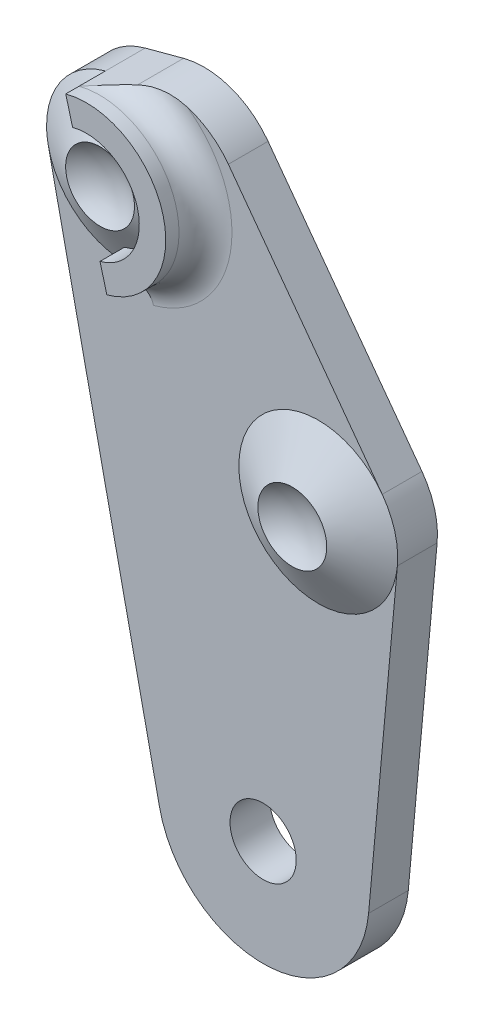
ISO-10303-21;
HEADER;
FILE_DESCRIPTION(('STEP AP214'),'2;1');
FILE_NAME('part.step','',(''),(''),'','','');
FILE_SCHEMA(('AUTOMOTIVE_DESIGN { 1 0 10303 214 1 1 1 1 }'));
ENDSEC;
DATA;
#1=APPLICATION_CONTEXT('core data for automotive mechanical design processes');
#2=APPLICATION_PROTOCOL_DEFINITION('international standard','automotive_design',2000,#1);
#3=PRODUCT_CONTEXT('',#1,'mechanical');
#4=PRODUCT('Part','Part','',(#3));
#5=PRODUCT_RELATED_PRODUCT_CATEGORY('part','',(#4));
#6=PRODUCT_DEFINITION_FORMATION('','',#4);
#7=PRODUCT_DEFINITION_CONTEXT('part definition',#1,'design');
#8=PRODUCT_DEFINITION('design','',#6,#7);
#9=PRODUCT_DEFINITION_SHAPE('','',#8);
#10=(LENGTH_UNIT() NAMED_UNIT(*) SI_UNIT(.MILLI.,.METRE.));
#11=(NAMED_UNIT(*) PLANE_ANGLE_UNIT() SI_UNIT($,.RADIAN.));
#12=(NAMED_UNIT(*) SI_UNIT($,.STERADIAN.) SOLID_ANGLE_UNIT());
#13=UNCERTAINTY_MEASURE_WITH_UNIT(LENGTH_MEASURE(1.E-05),#10,'distance_accuracy_value','');
#14=(GEOMETRIC_REPRESENTATION_CONTEXT(3) GLOBAL_UNCERTAINTY_ASSIGNED_CONTEXT((#13)) GLOBAL_UNIT_ASSIGNED_CONTEXT((#10,
#11,#12)) REPRESENTATION_CONTEXT('',''));
#15=CARTESIAN_POINT('',(0.,0.,0.));
#16=DIRECTION('',(0.,0.,1.));
#17=DIRECTION('',(1.,0.,0.));
#18=AXIS2_PLACEMENT_3D('',#15,#16,#17);
#19=CARTESIAN_POINT('',(-10.352761804101,38.6370330515627,5.));
#20=DIRECTION('',(0.,0.,-1.));
#21=DIRECTION('',(-1.,0.,0.));
#22=AXIS2_PLACEMENT_3D('',#19,#20,#21);
#23=CONICAL_SURFACE('',#22,2.53589838486217,1.0471975511966);
#24=CARTESIAN_POINT('',(-10.352761804101,38.6370330515627,4.96189209298539));
#25=DIRECTION('',(0.,0.,-1.));
#26=DIRECTION('',(-1.,0.,0.));
#27=AXIS2_PLACEMENT_3D('',#24,#25,#26);
#28=CIRCLE('',#27,2.60190321598159);
#29=CARTESIAN_POINT('',(-12.9546650200826,38.6370330515627,4.96189209298539));
#30=VERTEX_POINT('',#29);
#31=EDGE_CURVE('E402',#30,#30,#28,.F.);
#32=ORIENTED_EDGE('',*,*,#31,.F.);
#33=EDGE_LOOP('',(#32));
#34=FACE_BOUND('',#33,.T.);
#35=CARTESIAN_POINT('',(-10.352761804101,38.6370330515627,3.));
#36=DIRECTION('',(0.,0.,1.));
#37=DIRECTION('',(1.,0.,0.));
#38=AXIS2_PLACEMENT_3D('',#35,#36,#37);
#39=CIRCLE('',#38,6.);
#40=CARTESIAN_POINT('',(-8.79984753348584,32.8414780938283,3.));
#41=VERTEX_POINT('',#40);
#42=CARTESIAN_POINT('',(-16.2187134982231,37.3758388864057,3.));
#43=VERTEX_POINT('',#42);
#44=EDGE_CURVE('E377',#41,#43,#39,.F.);
#45=ORIENTED_EDGE('',*,*,#44,.F.);
#46=DIRECTION('',(0.224143868042018,-0.836516303737809,-0.499999999999997));
#47=VECTOR('',#46,1.);
#48=CARTESIAN_POINT('',(-10.352761804101,38.6370330515627,6.4641016151377));
#49=LINE('',#48,#47);
#50=CARTESIAN_POINT('',(-9.3174856236909,34.7733297464064,4.15470053837922));
#51=VERTEX_POINT('',#50);
#52=EDGE_CURVE('E414',#41,#51,#49,.F.);
#53=ORIENTED_EDGE('',*,*,#52,.T.);
#54=CARTESIAN_POINT('',(-10.352761804101,38.6370330515627,4.15470053837922));
#55=DIRECTION('',(0.,0.,-1.));
#56=DIRECTION('',(-1.,0.,0.));
#57=AXIS2_PLACEMENT_3D('',#54,#55,#56);
#58=CIRCLE('',#57,4.);
#59=CARTESIAN_POINT('',(-11.3880379845111,42.500736356719,4.15470053837922));
#60=VERTEX_POINT('',#59);
#61=EDGE_CURVE('E192',#60,#51,#58,.T.);
#62=ORIENTED_EDGE('',*,*,#61,.F.);
#63=DIRECTION('',(-0.224143868042018,0.836516303737809,-0.499999999999997));
#64=VECTOR('',#63,1.);
#65=CARTESIAN_POINT('',(-10.352761804101,38.6370330515627,6.4641016151377));
#66=LINE('',#65,#64);
#67=CARTESIAN_POINT('',(-11.9056760747161,44.4325880092971,3.));
#68=VERTEX_POINT('',#67);
#69=EDGE_CURVE('E409',#68,#60,#66,.F.);
#70=ORIENTED_EDGE('',*,*,#69,.F.);
#71=CARTESIAN_POINT('',(-10.352761804101,38.6370330515627,2.99999999999998));
#72=DIRECTION('',(0.,0.,1.));
#73=DIRECTION('',(1.,0.,0.));
#74=AXIS2_PLACEMENT_3D('',#71,#72,#73);
#75=CIRCLE('',#74,6.);
#76=EDGE_CURVE('E406',#43,#68,#75,.F.);
#77=ORIENTED_EDGE('',*,*,#76,.F.);
#78=EDGE_LOOP('',(#45,#53,#62,#70,#77));
#79=FACE_BOUND('',#78,.T.);
#80=ADVANCED_FACE('F75',(#34,#79),#23,.T.);
#81=CARTESIAN_POINT('',(-11.905676074716,44.4325880092971,3.));
#82=DIRECTION('',(-0.258819045102522,0.965925826289068,0.));
#83=DIRECTION('',(-0.965925826289068,-0.258819045102522,0.));
#84=AXIS2_PLACEMENT_3D('',#81,#82,#83);
#85=PLANE('',#84);
#86=DIRECTION('',(0.965925826289068,0.258819045102522,0.));
#87=VECTOR('',#86,1.);
#88=CARTESIAN_POINT('',(-11.905676074716,44.4325880092971,0.));
#89=LINE('',#88,#87);
#90=CARTESIAN_POINT('',(-11.9056760747161,44.4325880092971,0.));
#91=VERTEX_POINT('',#90);
#92=CARTESIAN_POINT('',(-9.00789859584892,45.2090451446047,0.));
#93=VERTEX_POINT('',#92);
#94=EDGE_CURVE('E449',#91,#93,#89,.T.);
#95=ORIENTED_EDGE('',*,*,#94,.F.);
#96=DIRECTION('',(0.,0.,-1.));
#97=VECTOR('',#96,1.);
#98=CARTESIAN_POINT('',(-11.9056760747161,44.4325880092971,3.));
#99=LINE('',#98,#97);
#100=EDGE_CURVE('E378',#68,#91,#99,.T.);
#101=ORIENTED_EDGE('',*,*,#100,.F.);
#102=DIRECTION('',(0.,0.,1.));
#103=VECTOR('',#102,1.);
#104=CARTESIAN_POINT('',(-11.9056760747161,44.4325880092971,3.));
#105=LINE('',#104,#103);
#106=CARTESIAN_POINT('',(-11.9056760747161,44.4325880092971,4.95765130950164));
#107=VERTEX_POINT('',#106);
#108=EDGE_CURVE('E12',#68,#107,#105,.T.);
#109=ORIENTED_EDGE('',*,*,#108,.T.);
#110=CARTESIAN_POINT('',(-9.00789859584756,45.209045144605,3.47265604705682));
#111=CARTESIAN_POINT('',(-9.04167602131454,45.1999963236107,3.48588271866781));
#112=CARTESIAN_POINT('',(-9.07539019870311,45.1909840043056,3.49929570066469));
#113=CARTESIAN_POINT('',(-9.14426785292339,45.172593222539,3.5271272091169));
#114=CARTESIAN_POINT('',(-9.1794249329425,45.1632174705452,3.54156336105153));
#115=CARTESIAN_POINT('',(-9.25113729258122,45.1440948968317,3.57147686776905));
#116=CARTESIAN_POINT('',(-9.28768565382772,45.134349999916,3.58697203592648));
#117=CARTESIAN_POINT('',(-9.36213166456127,45.1144905466228,3.61903400530673));
#118=CARTESIAN_POINT('',(-9.40002207359846,45.1043775082806,3.63561855543702));
#119=CARTESIAN_POINT('',(-9.47710507009265,45.0837863746335,3.66988454608979));
#120=CARTESIAN_POINT('',(-9.51629022913966,45.0733095732774,3.68758346951129));
#121=CARTESIAN_POINT('',(-9.59591876767549,45.0519992802468,3.72409700991216));
#122=CARTESIAN_POINT('',(-9.63635467851947,45.0411670302717,3.74292863232235));
#123=CARTESIAN_POINT('',(-9.7184448059844,45.0191571338207,3.7817190476073));
#124=CARTESIAN_POINT('',(-9.76009165385731,45.0079807897721,3.80169416516658));
#125=CARTESIAN_POINT('',(-9.84456890442968,44.985296210418,3.84277466150193));
#126=CARTESIAN_POINT('',(-9.88739217866162,44.9737894096257,3.86389548184489));
#127=CARTESIAN_POINT('',(-9.97419342460878,44.9504582124338,3.90726156361966));
#128=CARTESIAN_POINT('',(-10.0181646349715,44.9386353991369,3.9295211993021));
#129=CARTESIAN_POINT('',(-10.1072407286592,44.9146867939,3.97514801279929));
#130=CARTESIAN_POINT('',(-10.1523393698729,44.9025627363057,3.99852827732888));
#131=CARTESIAN_POINT('',(-10.2436534094104,44.8780211303456,4.04637280331815));
#132=CARTESIAN_POINT('',(-10.2898631111719,44.8656053093231,4.0708488096733));
#133=CARTESIAN_POINT('',(-10.3833979302187,44.8404987942321,4.12083298856933));
#134=CARTESIAN_POINT('',(-10.4307183430287,44.8278100542277,4.1463509392209));
#135=CARTESIAN_POINT('',(-10.5181082230742,44.8043786270815,4.19389590274084));
#136=CARTESIAN_POINT('',(-10.5582026490752,44.7936289858507,4.21587361758575));
#137=CARTESIAN_POINT('',(-10.6380743608064,44.7722031401885,4.25998929462108));
#138=CARTESIAN_POINT('',(-10.6778522615783,44.7615268230661,4.28212608920199));
#139=CARTESIAN_POINT('',(-10.7571369895071,44.7402578529714,4.32649580707994));
#140=CARTESIAN_POINT('',(-10.7966442428341,44.7296650381198,4.34872789217054));
#141=CARTESIAN_POINT('',(-10.8754137550958,44.7085581113514,4.39325550051093));
#142=CARTESIAN_POINT('',(-10.9146763469077,44.6980438556443,4.41555036748384));
#143=CARTESIAN_POINT('',(-10.9852091855151,44.6791824319643,4.45567795908585));
#144=CARTESIAN_POINT('',(-11.0164847006962,44.6708284170642,4.47349820820621));
#145=CARTESIAN_POINT('',(-11.085668188211,44.6523299598277,4.5130928424685));
#146=CARTESIAN_POINT('',(-11.123560026977,44.6421857886112,4.53489558372811));
#147=CARTESIAN_POINT('',(-11.2000819352414,44.6216807965588,4.57914604331005));
#148=CARTESIAN_POINT('',(-11.2387099304274,44.6113201132121,4.601597406804));
#149=CARTESIAN_POINT('',(-11.3223349427543,44.5888984016681,4.65027746334244));
#150=CARTESIAN_POINT('',(-11.3673270336477,44.5768400091873,4.67651580419771));
#151=CARTESIAN_POINT('',(-11.432086021426,44.5594857868869,4.71428689159529));
#152=CARTESIAN_POINT('',(-11.4518538815426,44.5541886205339,4.7258173115153));
#153=CARTESIAN_POINT('',(-11.5046538235443,44.5400427314638,4.75656853217785));
#154=CARTESIAN_POINT('',(-11.5376990857459,44.5311923789401,4.77576584978908));
#155=CARTESIAN_POINT('',(-11.6083552324944,44.5122602576858,4.8167415133963));
#156=CARTESIAN_POINT('',(-11.6459699852869,44.5021762682724,4.83851231300789));
#157=CARTESIAN_POINT('',(-11.7042623084172,44.4865565450032,4.8715312927657));
#158=CARTESIAN_POINT('',(-11.7248045781052,44.4810535861182,4.88303086092318));
#159=CARTESIAN_POINT('',(-11.7537366221794,44.4733014204199,4.89879506441286));
#160=CARTESIAN_POINT('',(-11.7620238279567,44.4710807189892,4.90326141960327));
#161=CARTESIAN_POINT('',(-11.7772764585073,44.4669928898353,4.91134848530935));
#162=CARTESIAN_POINT('',(-11.784233224436,44.4651281852922,4.91498662618188));
#163=CARTESIAN_POINT('',(-11.7973056675326,44.4616260654568,4.92162107273644));
#164=CARTESIAN_POINT('',(-11.8034110920751,44.4599911550067,4.92463868995831));
#165=CARTESIAN_POINT('',(-11.8152475983522,44.4568229224278,4.93025942187981));
#166=CARTESIAN_POINT('',(-11.820972366615,44.4552911897947,4.93287664690089));
#167=CARTESIAN_POINT('',(-11.8320445853177,44.4523283924517,4.93770341316084));
#168=CARTESIAN_POINT('',(-11.8373855439114,44.4508990877868,4.9399288180526));
#169=CARTESIAN_POINT('',(-11.8476913048996,44.448140102198,4.94396895313205));
#170=CARTESIAN_POINT('',(-11.8526491816093,44.4468123636893,4.94580253015313));
#171=CARTESIAN_POINT('',(-11.8621896871411,44.4442559477416,4.94905799975259));
#172=CARTESIAN_POINT('',(-11.8667650961756,44.4430293349206,4.95050221691119));
#173=CARTESIAN_POINT('',(-11.8735147092843,44.4412188650989,4.95240359716884));
#174=CARTESIAN_POINT('',(-11.8756592203849,44.4406434938958,4.95297440056373));
#175=CARTESIAN_POINT('',(-11.8798534924646,44.4395179377958,4.95401472601373));
#176=CARTESIAN_POINT('',(-11.8819023881481,44.4389679972706,4.95448796913324));
#177=CARTESIAN_POINT('',(-11.8859053807458,44.4378934250594,4.95533302862299));
#178=CARTESIAN_POINT('',(-11.8878586688654,44.4373690177506,4.9557089233246));
#179=CARTESIAN_POINT('',(-11.8916704135926,44.4363456673164,4.95635886181297));
#180=CARTESIAN_POINT('',(-11.8935281507023,44.4358469171159,4.9566373836276));
#181=CARTESIAN_POINT('',(-11.8971488773029,44.43487502671,4.95709246748238));
#182=CARTESIAN_POINT('',(-11.898911273816,44.4344020359085,4.95727391081613));
#183=CARTESIAN_POINT('',(-11.9023407966894,44.4334820395714,4.9575335492382));
#184=CARTESIAN_POINT('',(-11.904007546426,44.4330351110449,4.95761710237473));
#185=CARTESIAN_POINT('',(-11.9056760747162,44.4325880092971,4.95765130950164));
#186=B_SPLINE_CURVE_WITH_KNOTS('',3,(#110,#111,#112,#113,#114,#115,#116,#117,#118,#119,#120,
#121,#122,#123,#124,#125,#126,#127,#128,#129,#130,#131,#132,#133,#134,#135,#136,#137,#138,#139,
#140,#141,#142,#143,#144,#145,#146,#147,#148,#149,#150,#151,#152,#153,#154,#155,#156,#157,#158,
#159,#160,#161,#162,#163,#164,#165,#166,#167,#168,#169,#170,#171,#172,#173,#174,#175,#176,#177,
#178,#179,#180,#181,#182,#183,#184,#185),.UNSPECIFIED.,.F.,.F.,(4,2,2,2,2,2,2,2,2,2,2,2,2,2,2,2,
2,2,2,2,2,2,2,2,2,2,2,2,2,2,2,2,2,2,2,2,2,4),(0.,0.11215848790164,0.229590984478318,
0.352216367318028,0.479951775498032,0.612713478374603,0.750417795832572,0.892982079031889,
1.04032575747692,1.19237145570279,1.34904618093977,1.51028057844895,1.67599732779022,
1.81690500816826,1.95717803438317,2.09684030805282,2.23591730604148,2.34677558217332,
2.4814097123581,2.61900227365014,2.77938716130006,2.84985703809425,2.96754203000781,
3.10138636883245,3.17391236213883,3.20292944134138,3.22713553293138,3.24814492197249,
3.26757681716014,3.28545276369552,3.30179887705272,3.31664789706194,3.32352456606239,
3.3300439946601,3.33621379328448,3.34204289392527,3.34754184962866,3.35272320142118),.UNSPECIFIED.);
#187=CARTESIAN_POINT('',(-9.00789859584892,45.2090451446047,3.47265604705558));
#188=VERTEX_POINT('',#187);
#189=EDGE_CURVE('E282',#107,#188,#186,.F.);
#190=ORIENTED_EDGE('',*,*,#189,.T.);
#191=DIRECTION('',(0.,0.,-1.));
#192=VECTOR('',#191,1.);
#193=CARTESIAN_POINT('',(-9.00789859584892,45.2090451446047,3.));
#194=LINE('',#193,#192);
#195=EDGE_CURVE('E105',#188,#93,#194,.T.);
#196=ORIENTED_EDGE('',*,*,#195,.T.);
#197=EDGE_LOOP('',(#95,#101,#109,#190,#196));
#198=FACE_BOUND('',#197,.T.);
#199=ADVANCED_FACE('F289',(#198),#85,.T.);
#200=CARTESIAN_POINT('',(-10.352761804101,38.6370330515627,3.));
#201=DIRECTION('',(0.,0.,-1.));
#202=DIRECTION('',(-1.,0.,0.));
#203=AXIS2_PLACEMENT_3D('',#200,#201,#202);
#204=CYLINDRICAL_SURFACE('',#203,6.);
#205=DIRECTION('',(0.,0.,-1.));
#206=VECTOR('',#205,1.);
#207=CARTESIAN_POINT('',(-16.2187134982231,37.3758388864057,3.));
#208=LINE('',#207,#206);
#209=CARTESIAN_POINT('',(-16.2187134982231,37.3758388864057,0.));
#210=VERTEX_POINT('',#209);
#211=EDGE_CURVE('E384',#43,#210,#208,.T.);
#212=ORIENTED_EDGE('',*,*,#211,.F.);
#213=ORIENTED_EDGE('',*,*,#76,.T.);
#214=ORIENTED_EDGE('',*,*,#100,.T.);
#215=CARTESIAN_POINT('',(-10.352761804101,38.6370330515627,0.));
#216=DIRECTION('',(0.,0.,1.));
#217=DIRECTION('',(1.,0.,0.));
#218=AXIS2_PLACEMENT_3D('',#215,#216,#217);
#219=CIRCLE('',#218,6.);
#220=EDGE_CURVE('E453',#91,#210,#219,.T.);
#221=ORIENTED_EDGE('',*,*,#220,.T.);
#222=EDGE_LOOP('',(#212,#213,#214,#221));
#223=FACE_BOUND('',#222,.T.);
#224=ADVANCED_FACE('F299',(#223),#204,.T.);
#225=CARTESIAN_POINT('',(-7.82126892549614,-1.68159222020933,3.));
#226=DIRECTION('',(-0.977658615687017,-0.210199027526166,0.));
#227=DIRECTION('',(0.210199027526166,-0.977658615687017,0.));
#228=AXIS2_PLACEMENT_3D('',#225,#226,#227);
#229=PLANE('',#228);
#230=DIRECTION('',(-0.210199027526166,0.977658615687017,0.));
#231=VECTOR('',#230,1.);
#232=CARTESIAN_POINT('',(-7.82126892549614,-1.68159222020933,0.));
#233=LINE('',#232,#231);
#234=CARTESIAN_POINT('',(-7.82126892549614,-1.68159222020933,0.));
#235=VERTEX_POINT('',#234);
#236=EDGE_CURVE('E456',#235,#210,#233,.T.);
#237=ORIENTED_EDGE('',*,*,#236,.F.);
#238=DIRECTION('',(0.,0.,-1.));
#239=VECTOR('',#238,1.);
#240=CARTESIAN_POINT('',(-7.82126892549614,-1.68159222020933,3.));
#241=LINE('',#240,#239);
#242=CARTESIAN_POINT('',(-7.82126892549614,-1.68159222020933,3.));
#243=VERTEX_POINT('',#242);
#244=EDGE_CURVE('E392',#243,#235,#241,.T.);
#245=ORIENTED_EDGE('',*,*,#244,.F.);
#246=DIRECTION('',(-0.210199027526166,0.977658615687017,0.));
#247=VECTOR('',#246,1.);
#248=CARTESIAN_POINT('',(-7.82126892549614,-1.68159222020933,3.));
#249=LINE('',#248,#247);
#250=EDGE_CURVE('E423',#243,#43,#249,.T.);
#251=ORIENTED_EDGE('',*,*,#250,.T.);
#252=ORIENTED_EDGE('',*,*,#211,.T.);
#253=EDGE_LOOP('',(#237,#245,#251,#252));
#254=FACE_BOUND('',#253,.T.);
#255=ADVANCED_FACE('F498',(#254),#229,.T.);
#256=CARTESIAN_POINT('',(0.,0.,3.));
#257=DIRECTION('',(0.,0.,-1.));
#258=DIRECTION('',(-1.,0.,0.));
#259=AXIS2_PLACEMENT_3D('',#256,#257,#258);
#260=CYLINDRICAL_SURFACE('',#259,8.);
#261=CARTESIAN_POINT('',(0.,0.,0.));
#262=DIRECTION('',(0.,0.,1.));
#263=DIRECTION('',(1.,0.,0.));
#264=AXIS2_PLACEMENT_3D('',#261,#262,#263);
#265=CIRCLE('',#264,8.);
#266=CARTESIAN_POINT('',(7.96682404667648,-0.727814955395537,0.));
#267=VERTEX_POINT('',#266);
#268=EDGE_CURVE('E460',#235,#267,#265,.T.);
#269=ORIENTED_EDGE('',*,*,#268,.T.);
#270=DIRECTION('',(0.,0.,-1.));
#271=VECTOR('',#270,1.);
#272=CARTESIAN_POINT('',(7.96682404667648,-0.727814955395537,3.));
#273=LINE('',#272,#271);
#274=CARTESIAN_POINT('',(7.96682404667648,-0.727814955395537,3.));
#275=VERTEX_POINT('',#274);
#276=EDGE_CURVE('E483',#275,#267,#273,.T.);
#277=ORIENTED_EDGE('',*,*,#276,.F.);
#278=CARTESIAN_POINT('',(0.,0.,3.));
#279=DIRECTION('',(0.,0.,1.));
#280=DIRECTION('',(1.,0.,0.));
#281=AXIS2_PLACEMENT_3D('',#278,#279,#280);
#282=CIRCLE('',#281,8.);
#283=EDGE_CURVE('E434',#243,#275,#282,.T.);
#284=ORIENTED_EDGE('',*,*,#283,.F.);
#285=ORIENTED_EDGE('',*,*,#244,.T.);
#286=EDGE_LOOP('',(#269,#277,#284,#285));
#287=FACE_BOUND('',#286,.T.);
#288=ADVANCED_FACE('F489',(#287),#260,.T.);
#289=CARTESIAN_POINT('',(7.96682404667648,-0.727814955395536,3.));
#290=DIRECTION('',(0.99585300583456,-0.090976869424442,0.));
#291=DIRECTION('',(0.090976869424442,0.99585300583456,0.));
#292=AXIS2_PLACEMENT_3D('',#289,#290,#291);
#293=PLANE('',#292);
#294=DIRECTION('',(-0.090976869424442,-0.99585300583456,0.));
#295=VECTOR('',#294,1.);
#296=CARTESIAN_POINT('',(7.96682404667648,-0.727814955395536,0.));
#297=LINE('',#296,#295);
#298=CARTESIAN_POINT('',(10.1426742990136,23.0895248557464,0.));
#299=VERTEX_POINT('',#298);
#300=EDGE_CURVE('E464',#299,#267,#297,.T.);
#301=ORIENTED_EDGE('',*,*,#300,.F.);
#302=DIRECTION('',(0.,0.,-1.));
#303=VECTOR('',#302,1.);
#304=CARTESIAN_POINT('',(10.1426742990136,23.0895248557464,3.));
#305=LINE('',#304,#303);
#306=CARTESIAN_POINT('',(10.1426742990136,23.0895248557464,3.));
#307=VERTEX_POINT('',#306);
#308=EDGE_CURVE('E480',#307,#299,#305,.T.);
#309=ORIENTED_EDGE('',*,*,#308,.F.);
#310=DIRECTION('',(-0.090976869424442,-0.99585300583456,0.));
#311=VECTOR('',#310,1.);
#312=CARTESIAN_POINT('',(7.96682404667648,-0.727814955395536,3.));
#313=LINE('',#312,#311);
#314=EDGE_CURVE('E437',#307,#275,#313,.T.);
#315=ORIENTED_EDGE('',*,*,#314,.T.);
#316=ORIENTED_EDGE('',*,*,#276,.T.);
#317=EDGE_LOOP('',(#301,#309,#315,#316));
#318=FACE_BOUND('',#317,.T.);
#319=ADVANCED_FACE('F526',(#318),#293,.T.);
#320=CARTESIAN_POINT('',(4.16755626400626,23.635386072293,3.));
#321=DIRECTION('',(0.,0.,-1.));
#322=DIRECTION('',(-1.,0.,0.));
#323=AXIS2_PLACEMENT_3D('',#320,#321,#322);
#324=CYLINDRICAL_SURFACE('',#323,6.);
#325=DIRECTION('',(0.,0.,-1.));
#326=VECTOR('',#325,1.);
#327=CARTESIAN_POINT('',(8.99839288623359,27.1938994598394,3.));
#328=LINE('',#327,#326);
#329=CARTESIAN_POINT('',(8.99839288623359,27.1938994598394,3.));
#330=VERTEX_POINT('',#329);
#331=CARTESIAN_POINT('',(8.99839288623359,27.1938994598394,0.));
#332=VERTEX_POINT('',#331);
#333=EDGE_CURVE('E477',#330,#332,#328,.T.);
#334=ORIENTED_EDGE('',*,*,#333,.F.);
#335=CARTESIAN_POINT('',(4.16755626400626,23.635386072293,2.99999999999998));
#336=DIRECTION('',(0.,0.,1.));
#337=DIRECTION('',(1.,0.,0.));
#338=AXIS2_PLACEMENT_3D('',#335,#336,#337);
#339=CIRCLE('',#338,6.);
#340=EDGE_CURVE('E399',#330,#307,#339,.F.);
#341=ORIENTED_EDGE('',*,*,#340,.T.);
#342=ORIENTED_EDGE('',*,*,#308,.T.);
#343=CARTESIAN_POINT('',(4.16755626400626,23.635386072293,0.));
#344=DIRECTION('',(0.,0.,1.));
#345=DIRECTION('',(1.,0.,0.));
#346=AXIS2_PLACEMENT_3D('',#343,#344,#345);
#347=CIRCLE('',#346,6.);
#348=EDGE_CURVE('E468',#299,#332,#347,.T.);
#349=ORIENTED_EDGE('',*,*,#348,.T.);
#350=EDGE_LOOP('',(#334,#341,#342,#349));
#351=FACE_BOUND('',#350,.T.);
#352=ADVANCED_FACE('F523',(#351),#324,.T.);
#353=CARTESIAN_POINT('',(18.81874160834,13.8623491512695,3.));
#354=DIRECTION('',(0.80513943703789,0.593085564591071,0.));
#355=DIRECTION('',(-0.593085564591071,0.80513943703789,0.));
#356=AXIS2_PLACEMENT_3D('',#353,#354,#355);
#357=PLANE('',#356);
#358=DIRECTION('',(0.593085564591071,-0.80513943703789,0.));
#359=VECTOR('',#358,1.);
#360=CARTESIAN_POINT('',(18.81874160834,13.8623491512695,0.));
#361=LINE('',#360,#359);
#362=CARTESIAN_POINT('',(-2.62414770300645,42.9720035744167,0.));
#363=VERTEX_POINT('',#362);
#364=EDGE_CURVE('E424',#363,#332,#361,.T.);
#365=ORIENTED_EDGE('',*,*,#364,.F.);
#366=DIRECTION('',(0.,0.,-1.));
#367=VECTOR('',#366,1.);
#368=CARTESIAN_POINT('',(-2.62414770300645,42.9720035744167,3.));
#369=LINE('',#368,#367);
#370=CARTESIAN_POINT('',(-2.62414770300645,42.9720035744167,3.));
#371=VERTEX_POINT('',#370);
#372=EDGE_CURVE('E445',#371,#363,#369,.T.);
#373=ORIENTED_EDGE('',*,*,#372,.F.);
#374=DIRECTION('',(0.593085564591071,-0.80513943703789,0.));
#375=VECTOR('',#374,1.);
#376=CARTESIAN_POINT('',(18.81874160834,13.8623491512695,3.));
#377=LINE('',#376,#375);
#378=EDGE_CURVE('E441',#371,#330,#377,.T.);
#379=ORIENTED_EDGE('',*,*,#378,.T.);
#380=ORIENTED_EDGE('',*,*,#333,.T.);
#381=EDGE_LOOP('',(#365,#373,#379,#380));
#382=FACE_BOUND('',#381,.T.);
#383=ADVANCED_FACE('F306',(#382),#357,.T.);
#384=CARTESIAN_POINT('',(-7.45498432523379,39.4134901868702,3.));
#385=DIRECTION('',(0.,0.,-1.));
#386=DIRECTION('',(-1.,0.,0.));
#387=AXIS2_PLACEMENT_3D('',#384,#385,#386);
#388=CYLINDRICAL_SURFACE('',#387,6.);
#389=CARTESIAN_POINT('',(-7.45498432523379,39.4134901868702,0.));
#390=DIRECTION('',(0.,0.,1.));
#391=DIRECTION('',(1.,0.,0.));
#392=AXIS2_PLACEMENT_3D('',#389,#390,#391);
#393=CIRCLE('',#392,6.);
#394=EDGE_CURVE('E446',#363,#93,#393,.T.);
#395=ORIENTED_EDGE('',*,*,#394,.T.);
#396=ORIENTED_EDGE('',*,*,#195,.F.);
#397=CARTESIAN_POINT('',(-5.71724038179496,45.1563332098896,3.));
#398=CARTESIAN_POINT('',(-5.78957647480747,45.1782233401764,3.00000102332012));
#399=CARTESIAN_POINT('',(-5.86232472606309,45.1987570039787,3.00043580808809));
#400=CARTESIAN_POINT('',(-6.00709829927105,45.2366944953905,3.00224593253107));
#401=CARTESIAN_POINT('',(-6.07910985936967,45.2541517624252,3.00360267736712));
#402=CARTESIAN_POINT('',(-6.22227969961034,45.2860614835582,3.00728642848321));
#403=CARTESIAN_POINT('',(-6.29342677407534,45.3005664371552,3.00959375886041));
#404=CARTESIAN_POINT('',(-6.43474495359341,45.3267056799302,3.01520674210309));
#405=CARTESIAN_POINT('',(-6.50490739378125,45.3383912418686,3.01849166658617));
#406=CARTESIAN_POINT('',(-6.64414402019809,45.3590314293287,3.0260840008773));
#407=CARTESIAN_POINT('',(-6.71321199906194,45.3680358771548,3.03036970927621));
#408=CARTESIAN_POINT('',(-6.85015720512951,45.3834606448858,3.03998369516922));
#409=CARTESIAN_POINT('',(-6.91803059553569,45.3899290804022,3.04528938798177));
#410=CARTESIAN_POINT('',(-7.05249469602775,45.4004293765667,3.05695989333238));
#411=CARTESIAN_POINT('',(-7.11908381345834,45.4045075281903,3.06330131543012));
#412=CARTESIAN_POINT('',(-7.25088883657993,45.4103936496911,3.07705165567763));
#413=CARTESIAN_POINT('',(-7.31610531143576,45.4122458110944,3.08443642417116));
#414=CARTESIAN_POINT('',(-7.46556575884744,45.4140612729397,3.10280817440036));
#415=CARTESIAN_POINT('',(-7.54976849523752,45.4133094216749,3.11421596323489));
#416=CARTESIAN_POINT('',(-7.71342288229014,45.4083891901086,3.13869746973842));
#417=CARTESIAN_POINT('',(-7.79289714133521,45.4043976300909,3.15165604942544));
#418=CARTESIAN_POINT('',(-7.94706354756764,45.3935968182266,3.17910194830625));
#419=CARTESIAN_POINT('',(-8.02178747754163,45.3869467030428,3.19347310756978));
#420=CARTESIAN_POINT('',(-8.16646257362401,45.371361379577,3.22360019758148));
#421=CARTESIAN_POINT('',(-8.23645342727346,45.3625690915771,3.23923931378858));
#422=CARTESIAN_POINT('',(-8.3717090824108,45.3431867718015,3.27174905014528));
#423=CARTESIAN_POINT('',(-8.43702016875408,45.3327239805993,3.28850273919144));
#424=CARTESIAN_POINT('',(-8.56299061850835,45.3104369241383,3.32308457975468));
#425=CARTESIAN_POINT('',(-8.62370190342382,45.2987251925121,3.34079595993662));
#426=CARTESIAN_POINT('',(-8.74057096751896,45.2743268288565,3.377131831572));
#427=CARTESIAN_POINT('',(-8.79678540678504,45.2617390783501,3.39564003929345));
#428=CARTESIAN_POINT('',(-8.90476572117757,45.2359285088055,3.433418077931));
#429=CARTESIAN_POINT('',(-8.95659300415129,45.2227919672977,3.45257160789456));
#430=CARTESIAN_POINT('',(-9.00789859584757,45.209045144605,3.47265604705681));
#431=B_SPLINE_CURVE_WITH_KNOTS('',3,(#397,#398,#399,#400,#401,#402,#403,#404,#405,#406,#407,
#408,#409,#410,#411,#412,#413,#414,#415,#416,#417,#418,#419,#420,#421,#422,#423,#424,#425,#426,
#427,#428,#429,#430),.UNSPECIFIED.,.F.,.F.,(4,2,2,2,2,2,2,2,2,2,2,2,2,2,2,2,4),(0.,
0.226714860660498,0.448987782518371,0.666874282536189,0.880435227575898,1.08973647991077,
1.29484842884466,1.49584430526172,1.69278026509075,1.94759774959243,2.18937419062216,
2.41844197452023,2.63512991533829,2.83976174030775,3.03265467579948,3.21411838579815,
3.3844544584645),.UNSPECIFIED.);
#432=CARTESIAN_POINT('',(-5.71724038179491,45.1563332098896,3.));
#433=VERTEX_POINT('',#432);
#434=EDGE_CURVE('E89',#188,#433,#431,.F.);
#435=ORIENTED_EDGE('',*,*,#434,.T.);
#436=CARTESIAN_POINT('',(-7.45498432523379,39.4134901868702,3.));
#437=DIRECTION('',(0.,0.,1.));
#438=DIRECTION('',(1.,0.,0.));
#439=AXIS2_PLACEMENT_3D('',#436,#437,#438);
#440=CIRCLE('',#439,6.);
#441=EDGE_CURVE('E418',#371,#433,#440,.T.);
#442=ORIENTED_EDGE('',*,*,#441,.F.);
#443=ORIENTED_EDGE('',*,*,#372,.T.);
#444=EDGE_LOOP('',(#395,#396,#435,#442,#443));
#445=FACE_BOUND('',#444,.T.);
#446=ADVANCED_FACE('F301',(#445),#388,.T.);
#447=CARTESIAN_POINT('',(0.,0.,0.));
#448=DIRECTION('',(0.,0.,1.));
#449=DIRECTION('',(1.,0.,0.));
#450=AXIS2_PLACEMENT_3D('',#447,#448,#449);
#451=PLANE('',#450);
#452=CARTESIAN_POINT('',(0.,0.,0.));
#453=DIRECTION('',(0.,0.,1.));
#454=DIRECTION('',(1.,0.,0.));
#455=AXIS2_PLACEMENT_3D('',#452,#453,#454);
#456=CIRCLE('',#455,2.5);
#457=CARTESIAN_POINT('',(2.5,0.,0.));
#458=VERTEX_POINT('',#457);
#459=EDGE_CURVE('E429',#458,#458,#456,.T.);
#460=ORIENTED_EDGE('',*,*,#459,.T.);
#461=EDGE_LOOP('',(#460));
#462=FACE_BOUND('',#461,.T.);
#463=ORIENTED_EDGE('',*,*,#394,.F.);
#464=ORIENTED_EDGE('',*,*,#364,.T.);
#465=ORIENTED_EDGE('',*,*,#348,.F.);
#466=ORIENTED_EDGE('',*,*,#300,.T.);
#467=ORIENTED_EDGE('',*,*,#268,.F.);
#468=ORIENTED_EDGE('',*,*,#236,.T.);
#469=ORIENTED_EDGE('',*,*,#220,.F.);
#470=ORIENTED_EDGE('',*,*,#94,.T.);
#471=EDGE_LOOP('',(#463,#464,#465,#466,#467,#468,#469,#470));
#472=FACE_BOUND('',#471,.T.);
#473=ADVANCED_FACE('F305',(#462,#472),#451,.F.);
#474=CARTESIAN_POINT('',(0.,0.,3.));
#475=DIRECTION('',(0.,0.,1.));
#476=DIRECTION('',(1.,0.,0.));
#477=AXIS2_PLACEMENT_3D('',#474,#475,#476);
#478=PLANE('',#477);
#479=ORIENTED_EDGE('',*,*,#441,.T.);
#480=CARTESIAN_POINT('',(-9.51653409795973,30.6808578886165,3.));
#481=CARTESIAN_POINT('',(-8.37062527249946,30.8012977594022,3.));
#482=CARTESIAN_POINT('',(-7.25238222946856,31.1728144078287,3.));
#483=CARTESIAN_POINT('',(-5.27245200150055,32.3507491112735,3.));
#484=CARTESIAN_POINT('',(-4.41220543882216,33.156457941298,3.));
#485=CARTESIAN_POINT('',(-3.10729915142754,35.0551083710301,3.));
#486=CARTESIAN_POINT('',(-2.66338995503262,36.1469579452548,3.));
#487=CARTESIAN_POINT('',(-2.27323670824012,38.4175160962862,3.));
#488=CARTESIAN_POINT('',(-2.32721705791139,39.5949187416139,3.));
#489=CARTESIAN_POINT('',(-2.92349332966553,41.8202520831519,3.));
#490=CARTESIAN_POINT('',(-3.46544629820813,42.8669028593212,3.));
#491=CARTESIAN_POINT('',(-4.93860799681854,44.6381872754936,3.));
#492=CARTESIAN_POINT('',(-5.86896942497875,45.361802145683,3.));
#493=CARTESIAN_POINT('',(-7.94837663429056,46.3536285070401,3.));
#494=CARTESIAN_POINT('',(-9.09622642609671,46.6212695405522,3.));
#495=CARTESIAN_POINT('',(-11.3998636529638,46.6514258037573,3.));
#496=CARTESIAN_POINT('',(-12.5540488600446,46.4140471377039,3.));
#497=CARTESIAN_POINT('',(-13.6066549487074,45.9453967127035,3.));
#498=(BOUNDED_CURVE() B_SPLINE_CURVE(3,(#480,#481,#482,#483,#484,#485,#486,#487,#488,#489,#490,
#491,#492,#493,#494,#495,#496,#497),.UNSPECIFIED.,.F.,.F.) B_SPLINE_CURVE_WITH_KNOTS((4,2,2,2,2,
2,2,2,4),(-1.46607657167523,-1.03410758180664,-0.602138591938039,-0.170169602069443,
0.261799387799153,0.693768377667749,1.12573736753634,1.55770635740494,1.98967534727354),
.UNSPECIFIED.) CURVE() GEOMETRIC_REPRESENTATION_ITEM() RATIONAL_B_SPLINE_CURVE((1.,1.,1.,1.,1.,
1.,1.,1.,1.,1.,1.,1.,1.,1.,1.,1.,1.,1.)) REPRESENTATION_ITEM(''));
#499=CARTESIAN_POINT('',(-8.28236417208898,30.9102038970237,3.));
#500=VERTEX_POINT('',#499);
#501=EDGE_CURVE('E332',#433,#500,#498,.F.);
#502=ORIENTED_EDGE('',*,*,#501,.T.);
#503=DIRECTION('',(-0.258819045102525,0.965925826289067,0.));
#504=VECTOR('',#503,1.);
#505=CARTESIAN_POINT('',(0.,0.,3.));
#506=LINE('',#505,#504);
#507=EDGE_CURVE('E417',#500,#41,#506,.T.);
#508=ORIENTED_EDGE('',*,*,#507,.T.);
#509=ORIENTED_EDGE('',*,*,#44,.T.);
#510=ORIENTED_EDGE('',*,*,#250,.F.);
#511=ORIENTED_EDGE('',*,*,#283,.T.);
#512=ORIENTED_EDGE('',*,*,#314,.F.);
#513=CARTESIAN_POINT('',(4.16755626400626,23.635386072293,3.));
#514=DIRECTION('',(0.,0.,1.));
#515=DIRECTION('',(1.,0.,0.));
#516=AXIS2_PLACEMENT_3D('',#513,#514,#515);
#517=CIRCLE('',#516,6.);
#518=EDGE_CURVE('E197',#330,#307,#517,.T.);
#519=ORIENTED_EDGE('',*,*,#518,.F.);
#520=ORIENTED_EDGE('',*,*,#378,.F.);
#521=EDGE_LOOP('',(#479,#502,#508,#509,#510,#511,#512,#519,#520));
#522=FACE_BOUND('',#521,.T.);
#523=CARTESIAN_POINT('',(0.,0.,3.));
#524=DIRECTION('',(0.,0.,1.));
#525=DIRECTION('',(1.,0.,0.));
#526=AXIS2_PLACEMENT_3D('',#523,#524,#525);
#527=CIRCLE('',#526,2.5);
#528=CARTESIAN_POINT('',(2.5,0.,3.));
#529=VERTEX_POINT('',#528);
#530=EDGE_CURVE('E530',#529,#529,#527,.T.);
#531=ORIENTED_EDGE('',*,*,#530,.F.);
#532=EDGE_LOOP('',(#531));
#533=FACE_BOUND('',#532,.T.);
#534=ADVANCED_FACE('F506',(#522,#533),#478,.T.);
#535=CARTESIAN_POINT('',(0.,0.,-47.));
#536=DIRECTION('',(0.,0.,1.));
#537=DIRECTION('',(1.,0.,0.));
#538=AXIS2_PLACEMENT_3D('',#535,#536,#537);
#539=CYLINDRICAL_SURFACE('',#538,2.5);
#540=ORIENTED_EDGE('',*,*,#530,.T.);
#541=EDGE_LOOP('',(#540));
#542=FACE_BOUND('',#541,.T.);
#543=ORIENTED_EDGE('',*,*,#459,.F.);
#544=EDGE_LOOP('',(#543));
#545=FACE_BOUND('',#544,.T.);
#546=ADVANCED_FACE('F541',(#542,#545),#539,.F.);
#547=CARTESIAN_POINT('',(-10.352761804101,38.6370330515627,8.));
#548=DIRECTION('',(0.,1.,0.));
#549=DIRECTION('',(0.,0.,-1.));
#550=AXIS2_PLACEMENT_3D('',#547,#548,#549);
#551=SPHERICAL_SURFACE('',#550,4.00000000000001);
#552=CARTESIAN_POINT('',(-10.352761804101,38.6370330515627,8.));
#553=DIRECTION('',(0.,0.,-1.));
#554=DIRECTION('',(-1.,0.,0.));
#555=AXIS2_PLACEMENT_3D('',#552,#553,#554);
#556=SPHERICAL_SURFACE('',#555,4.00000000000001);
#557=ORIENTED_EDGE('',*,*,#31,.T.);
#558=EDGE_LOOP('',(#557));
#559=FACE_BOUND('',#558,.T.);
#560=ADVANCED_FACE('F543',(#559),#556,.F.);
#561=CARTESIAN_POINT('',(4.16755626400626,23.635386072293,8.));
#562=DIRECTION('',(0.,1.,0.));
#563=DIRECTION('',(0.,0.,-1.));
#564=AXIS2_PLACEMENT_3D('',#561,#562,#563);
#565=SPHERICAL_SURFACE('',#564,4.);
#566=CARTESIAN_POINT('',(4.16755626400626,23.635386072293,8.));
#567=DIRECTION('',(0.,0.,-1.));
#568=DIRECTION('',(-1.,0.,0.));
#569=AXIS2_PLACEMENT_3D('',#566,#567,#568);
#570=SPHERICAL_SURFACE('',#569,4.);
#571=CARTESIAN_POINT('',(4.16755626400626,23.635386072293,4.96189209298539));
#572=DIRECTION('',(0.,0.,-1.));
#573=DIRECTION('',(-1.,0.,0.));
#574=AXIS2_PLACEMENT_3D('',#571,#572,#573);
#575=CIRCLE('',#574,2.60190321598158);
#576=CARTESIAN_POINT('',(1.56565304802467,23.635386072293,4.96189209298539));
#577=VERTEX_POINT('',#576);
#578=EDGE_CURVE('E382',#577,#577,#575,.F.);
#579=ORIENTED_EDGE('',*,*,#578,.T.);
#580=EDGE_LOOP('',(#579));
#581=FACE_BOUND('',#580,.T.);
#582=ADVANCED_FACE('F550',(#581),#570,.F.);
#583=CARTESIAN_POINT('',(4.16755626400626,23.635386072293,5.));
#584=DIRECTION('',(0.,0.,-1.));
#585=DIRECTION('',(-1.,0.,0.));
#586=AXIS2_PLACEMENT_3D('',#583,#584,#585);
#587=CONICAL_SURFACE('',#586,2.53589838486217,1.0471975511966);
#588=ORIENTED_EDGE('',*,*,#340,.F.);
#589=ORIENTED_EDGE('',*,*,#518,.T.);
#590=EDGE_LOOP('',(#588,#589));
#591=FACE_BOUND('',#590,.T.);
#592=ORIENTED_EDGE('',*,*,#578,.F.);
#593=EDGE_LOOP('',(#592));
#594=FACE_BOUND('',#593,.T.);
#595=ADVANCED_FACE('F308',(#591,#594),#587,.T.);
#596=CARTESIAN_POINT('',(-10.352761804101,38.6370330515627,6.));
#597=DIRECTION('',(0.,0.,-1.));
#598=DIRECTION('',(-1.,0.,0.));
#599=AXIS2_PLACEMENT_3D('',#596,#597,#598);
#600=CYLINDRICAL_SURFACE('',#599,4.);
#601=DIRECTION('',(0.,0.,-1.));
#602=VECTOR('',#601,1.);
#603=CARTESIAN_POINT('',(-11.3880379845111,42.500736356719,6.));
#604=LINE('',#603,#602);
#605=CARTESIAN_POINT('',(-11.3880379845111,42.500736356719,6.));
#606=VERTEX_POINT('',#605);
#607=EDGE_CURVE('E220',#606,#60,#604,.T.);
#608=ORIENTED_EDGE('',*,*,#607,.T.);
#609=ORIENTED_EDGE('',*,*,#61,.T.);
#610=DIRECTION('',(0.,0.,-1.));
#611=VECTOR('',#610,1.);
#612=CARTESIAN_POINT('',(-9.3174856236909,34.7733297464064,6.));
#613=LINE('',#612,#611);
#614=CARTESIAN_POINT('',(-9.3174856236909,34.7733297464064,6.));
#615=VERTEX_POINT('',#614);
#616=EDGE_CURVE('E184',#615,#51,#613,.T.);
#617=ORIENTED_EDGE('',*,*,#616,.F.);
#618=CARTESIAN_POINT('',(-10.352761804101,38.6370330515627,6.));
#619=DIRECTION('',(0.,0.,1.));
#620=DIRECTION('',(1.,0.,0.));
#621=AXIS2_PLACEMENT_3D('',#618,#619,#620);
#622=CIRCLE('',#621,4.);
#623=EDGE_CURVE('E189',#615,#606,#622,.T.);
#624=ORIENTED_EDGE('',*,*,#623,.T.);
#625=EDGE_LOOP('',(#608,#609,#617,#624));
#626=FACE_BOUND('',#625,.T.);
#627=ADVANCED_FACE('F187',(#626),#600,.F.);
#628=CARTESIAN_POINT('',(0.,0.,6.));
#629=DIRECTION('',(0.965925826289067,0.258819045102525,0.));
#630=DIRECTION('',(-0.258819045102525,0.965925826289067,0.));
#631=AXIS2_PLACEMENT_3D('',#628,#629,#630);
#632=PLANE('',#631);
#633=ORIENTED_EDGE('',*,*,#52,.F.);
#634=ORIENTED_EDGE('',*,*,#507,.F.);
#635=CARTESIAN_POINT('',(-8.79996358009163,32.8419111856572,5.));
#636=CARTESIAN_POINT('',(-8.79996358009127,32.841911185655,2.9999999999974));
#637=CARTESIAN_POINT('',(-8.2823641720889,30.9102038970237,3.));
#638=(BOUNDED_CURVE() B_SPLINE_CURVE(2,(#635,#636,#637),.UNSPECIFIED.,.F.,
.F.) B_SPLINE_CURVE_WITH_KNOTS((3,3),(0.,1.),
.UNSPECIFIED.) CURVE() GEOMETRIC_REPRESENTATION_ITEM() RATIONAL_B_SPLINE_CURVE((1.,
0.707106781186548,1.)) REPRESENTATION_ITEM(''));
#639=CARTESIAN_POINT('',(-8.79990564578874,32.8416946158561,5.));
#640=VERTEX_POINT('',#639);
#641=EDGE_CURVE('E320',#500,#640,#638,.F.);
#642=ORIENTED_EDGE('',*,*,#641,.T.);
#643=DIRECTION('',(0.,0.,-1.));
#644=VECTOR('',#643,1.);
#645=CARTESIAN_POINT('',(-8.79984753348585,32.8414780938283,6.));
#646=LINE('',#645,#644);
#647=CARTESIAN_POINT('',(-8.79984753348585,32.8414780938283,6.));
#648=VERTEX_POINT('',#647);
#649=EDGE_CURVE('E198',#648,#640,#646,.T.);
#650=ORIENTED_EDGE('',*,*,#649,.F.);
#651=DIRECTION('',(0.258819045102525,-0.965925826289067,0.));
#652=VECTOR('',#651,1.);
#653=CARTESIAN_POINT('',(0.,0.,6.));
#654=LINE('',#653,#652);
#655=EDGE_CURVE('E201',#615,#648,#654,.T.);
#656=ORIENTED_EDGE('',*,*,#655,.F.);
#657=ORIENTED_EDGE('',*,*,#616,.T.);
#658=EDGE_LOOP('',(#633,#634,#642,#650,#656,#657));
#659=FACE_BOUND('',#658,.T.);
#660=ADVANCED_FACE('F202',(#659),#632,.F.);
#661=CARTESIAN_POINT('',(-10.352761804101,38.6370330515627,6.));
#662=DIRECTION('',(0.,0.,-1.));
#663=DIRECTION('',(-1.,0.,0.));
#664=AXIS2_PLACEMENT_3D('',#661,#662,#663);
#665=CYLINDRICAL_SURFACE('',#664,6.);
#666=ORIENTED_EDGE('',*,*,#649,.T.);
#667=CARTESIAN_POINT('',(-12.7931816625558,44.1183057974183,5.));
#668=CARTESIAN_POINT('',(-12.0037270960593,44.4697936161703,5.));
#669=CARTESIAN_POINT('',(-11.1380881907479,44.6478276157079,5.));
#670=CARTESIAN_POINT('',(-9.41036027059796,44.6252104183056,5.));
#671=CARTESIAN_POINT('',(-8.54947292674351,44.4244796431712,5.));
#672=CARTESIAN_POINT('',(-6.98991751975897,43.6806098721525,5.));
#673=CARTESIAN_POINT('',(-6.29214644863961,43.1378987195108,5.));
#674=CARTESIAN_POINT('',(-5.18727517468089,41.8094354073816,5.));
#675=CARTESIAN_POINT('',(-4.78081044827476,41.0244473252545,5.));
#676=CARTESIAN_POINT('',(-4.33360324445843,39.3554473191012,5.));
#677=CARTESIAN_POINT('',(-4.29311798220546,38.4723953351047,5.));
#678=CARTESIAN_POINT('',(-4.5857329172996,36.7694767218324,5.));
#679=CARTESIAN_POINT('',(-4.91866481459563,35.9505895411631,5.));
#680=CARTESIAN_POINT('',(-5.89734453014214,34.5266017188643,5.));
#681=CARTESIAN_POINT('',(-6.54252945214884,33.9223200963488,5.));
#682=CARTESIAN_POINT('',(-8.0274771231285,33.0388690687591,5.));
#683=CARTESIAN_POINT('',(-8.86615940539812,32.7602315824414,5.));
#684=CARTESIAN_POINT('',(-9.72559102449504,32.669901679353,5.));
#685=(BOUNDED_CURVE() B_SPLINE_CURVE(3,(#667,#668,#669,#670,#671,#672,#673,#674,#675,#676,#677,
#678,#679,#680,#681,#682,#683,#684),.UNSPECIFIED.,.F.,.F.) B_SPLINE_CURVE_WITH_KNOTS((4,2,2,2,2,
2,2,2,4),(-1.46607657167523,-1.03410758180664,-0.602138591938039,-0.170169602069443,
0.261799387799153,0.693768377667749,1.12573736753634,1.55770635740494,1.98967534727354),
.UNSPECIFIED.) CURVE() GEOMETRIC_REPRESENTATION_ITEM() RATIONAL_B_SPLINE_CURVE((1.,1.,1.,1.,1.,
1.,1.,1.,1.,1.,1.,1.,1.,1.,1.,1.,1.,1.)) REPRESENTATION_ITEM(''));
#686=CARTESIAN_POINT('',(-11.9056180514132,44.4323714633825,5.));
#687=VERTEX_POINT('',#686);
#688=EDGE_CURVE('E238',#640,#687,#685,.F.);
#689=ORIENTED_EDGE('',*,*,#688,.T.);
#690=DIRECTION('',(0.,0.,-1.));
#691=VECTOR('',#690,1.);
#692=CARTESIAN_POINT('',(-11.9056760747161,44.4325880092971,6.));
#693=LINE('',#692,#691);
#694=CARTESIAN_POINT('',(-11.9056760747161,44.4325880092971,6.));
#695=VERTEX_POINT('',#694);
#696=EDGE_CURVE('E223',#695,#687,#693,.T.);
#697=ORIENTED_EDGE('',*,*,#696,.F.);
#698=CARTESIAN_POINT('',(-10.352761804101,38.6370330515627,6.));
#699=DIRECTION('',(0.,0.,1.));
#700=DIRECTION('',(1.,0.,0.));
#701=AXIS2_PLACEMENT_3D('',#698,#699,#700);
#702=CIRCLE('',#701,6.);
#703=EDGE_CURVE('E208',#695,#648,#702,.F.);
#704=ORIENTED_EDGE('',*,*,#703,.T.);
#705=EDGE_LOOP('',(#666,#689,#697,#704));
#706=FACE_BOUND('',#705,.T.);
#707=ADVANCED_FACE('F244',(#706),#665,.T.);
#708=CARTESIAN_POINT('',(0.,0.,6.));
#709=DIRECTION('',(-0.965925826289067,-0.258819045102525,0.));
#710=DIRECTION('',(0.258819045102525,-0.965925826289067,0.));
#711=AXIS2_PLACEMENT_3D('',#708,#709,#710);
#712=PLANE('',#711);
#713=ORIENTED_EDGE('',*,*,#696,.T.);
#714=CARTESIAN_POINT('',(-12.423159436113,46.3638622061022,3.));
#715=CARTESIAN_POINT('',(-11.9055600281101,44.4321549174673,3.00000000000124));
#716=CARTESIAN_POINT('',(-11.9055600281103,44.4321549174679,5.));
#717=(BOUNDED_CURVE() B_SPLINE_CURVE(2,(#714,#715,#716),.UNSPECIFIED.,.F.,
.F.) B_SPLINE_CURVE_WITH_KNOTS((3,3),(0.,1.),
.UNSPECIFIED.) CURVE() GEOMETRIC_REPRESENTATION_ITEM() RATIONAL_B_SPLINE_CURVE((1.,
0.707106781186548,1.)) REPRESENTATION_ITEM(''));
#718=EDGE_CURVE('E97',#687,#107,#717,.F.);
#719=ORIENTED_EDGE('',*,*,#718,.T.);
#720=ORIENTED_EDGE('',*,*,#108,.F.);
#721=ORIENTED_EDGE('',*,*,#69,.T.);
#722=ORIENTED_EDGE('',*,*,#607,.F.);
#723=DIRECTION('',(-0.258819045102525,0.965925826289067,0.));
#724=VECTOR('',#723,1.);
#725=CARTESIAN_POINT('',(0.,0.,6.));
#726=LINE('',#725,#724);
#727=EDGE_CURVE('E212',#606,#695,#726,.T.);
#728=ORIENTED_EDGE('',*,*,#727,.T.);
#729=EDGE_LOOP('',(#713,#719,#720,#721,#722,#728));
#730=FACE_BOUND('',#729,.T.);
#731=ADVANCED_FACE('F254',(#730),#712,.T.);
#732=CARTESIAN_POINT('',(0.,0.,6.));
#733=DIRECTION('',(0.,0.,1.));
#734=DIRECTION('',(1.,0.,0.));
#735=AXIS2_PLACEMENT_3D('',#732,#733,#734);
#736=PLANE('',#735);
#737=ORIENTED_EDGE('',*,*,#623,.F.);
#738=ORIENTED_EDGE('',*,*,#655,.T.);
#739=ORIENTED_EDGE('',*,*,#703,.F.);
#740=ORIENTED_EDGE('',*,*,#727,.F.);
#741=EDGE_LOOP('',(#737,#738,#739,#740));
#742=FACE_BOUND('',#741,.T.);
#743=ADVANCED_FACE('F210',(#742),#736,.T.);
#744=CARTESIAN_POINT('',(-9.72559102449504,32.669901679353,5.));
#745=CARTESIAN_POINT('',(-8.86615940539812,32.7602315824414,5.));
#746=CARTESIAN_POINT('',(-8.0274771231285,33.0388690687591,5.));
#747=CARTESIAN_POINT('',(-6.54252945214884,33.9223200963488,5.));
#748=CARTESIAN_POINT('',(-5.89734453014214,34.5266017188643,5.));
#749=CARTESIAN_POINT('',(-4.91866481459563,35.9505895411631,5.));
#750=CARTESIAN_POINT('',(-4.5857329172996,36.7694767218324,5.));
#751=CARTESIAN_POINT('',(-4.29311798220546,38.4723953351047,5.));
#752=CARTESIAN_POINT('',(-4.33360324445843,39.3554473191012,5.));
#753=CARTESIAN_POINT('',(-4.78081044827476,41.0244473252545,5.));
#754=CARTESIAN_POINT('',(-5.18727517468089,41.8094354073816,5.));
#755=CARTESIAN_POINT('',(-6.29214644863961,43.1378987195108,5.));
#756=CARTESIAN_POINT('',(-6.98991751975897,43.6806098721525,5.));
#757=CARTESIAN_POINT('',(-8.54947292674351,44.4244796431712,5.));
#758=CARTESIAN_POINT('',(-9.41036027059796,44.6252104183056,5.));
#759=CARTESIAN_POINT('',(-11.1380881907479,44.6478276157079,5.));
#760=CARTESIAN_POINT('',(-12.0037270960593,44.4697936161703,5.));
#761=CARTESIAN_POINT('',(-12.7931816625558,44.1183057974183,5.));
#762=CARTESIAN_POINT('',(-9.72559102449504,32.669901679353,3.));
#763=CARTESIAN_POINT('',(-8.86615940539632,32.7602315824349,2.999999999994));
#764=CARTESIAN_POINT('',(-8.02747712313023,33.0388690687614,3.00000000000019));
#765=CARTESIAN_POINT('',(-6.54252945214711,33.9223200963465,2.99999999999981));
#766=CARTESIAN_POINT('',(-5.89734453014187,34.5266017188641,3.));
#767=CARTESIAN_POINT('',(-4.91866481459591,35.9505895411633,3.));
#768=CARTESIAN_POINT('',(-4.5857329172999,36.7694767218325,3.));
#769=CARTESIAN_POINT('',(-4.29311798220516,38.4723953351046,3.));
#770=CARTESIAN_POINT('',(-4.33360324445916,39.3554473191011,3.));
#771=CARTESIAN_POINT('',(-4.78081044827402,41.0244473252546,3.));
#772=CARTESIAN_POINT('',(-5.18727517468088,41.8094354073816,3.));
#773=CARTESIAN_POINT('',(-6.29214644863962,43.1378987195108,3.));
#774=CARTESIAN_POINT('',(-6.98991751975912,43.6806098721529,3.00000000000019));
#775=CARTESIAN_POINT('',(-8.54947292674335,44.4244796431708,2.99999999999981));
#776=CARTESIAN_POINT('',(-9.41036027059797,44.6252104183048,3.));
#777=CARTESIAN_POINT('',(-11.1380881907479,44.6478276157086,3.));
#778=CARTESIAN_POINT('',(-12.0037270960588,44.4697936161686,3.00000000000281));
#779=CARTESIAN_POINT('',(-12.7931816625558,44.1183057974183,3.));
#780=CARTESIAN_POINT('',(-9.51653409795973,30.6808578886165,3.));
#781=CARTESIAN_POINT('',(-8.37062527249946,30.8012977594022,3.));
#782=CARTESIAN_POINT('',(-7.25238222946856,31.1728144078287,3.));
#783=CARTESIAN_POINT('',(-5.27245200150055,32.3507491112735,3.));
#784=CARTESIAN_POINT('',(-4.41220543882216,33.156457941298,3.));
#785=CARTESIAN_POINT('',(-3.10729915142754,35.0551083710301,3.));
#786=CARTESIAN_POINT('',(-2.66338995503262,36.1469579452548,3.));
#787=CARTESIAN_POINT('',(-2.27323670824012,38.4175160962862,3.));
#788=CARTESIAN_POINT('',(-2.32721705791139,39.5949187416139,3.));
#789=CARTESIAN_POINT('',(-2.92349332966553,41.8202520831519,3.));
#790=CARTESIAN_POINT('',(-3.46544629820813,42.8669028593212,3.));
#791=CARTESIAN_POINT('',(-4.93860799681854,44.6381872754936,3.));
#792=CARTESIAN_POINT('',(-5.86896942497875,45.361802145683,3.));
#793=CARTESIAN_POINT('',(-7.94837663429056,46.3536285070401,3.));
#794=CARTESIAN_POINT('',(-9.09622642609671,46.6212695405522,3.));
#795=CARTESIAN_POINT('',(-11.3998636529638,46.6514258037573,3.));
#796=CARTESIAN_POINT('',(-12.5540488600446,46.4140471377039,3.));
#797=CARTESIAN_POINT('',(-13.6066549487074,45.9453967127035,3.));
#798=(BOUNDED_SURFACE() B_SPLINE_SURFACE(2,3,((#744,#745,#746,#747,#748,#749,#750,#751,#752,
#753,#754,#755,#756,#757,#758,#759,#760,#761),(#762,#763,#764,#765,#766,#767,#768,#769,#770,
#771,#772,#773,#774,#775,#776,#777,#778,#779),(#780,#781,#782,#783,#784,#785,#786,#787,#788,
#789,#790,#791,#792,#793,#794,#795,#796,#797)),.UNSPECIFIED.,.F.,.F.,
.F.) B_SPLINE_SURFACE_WITH_KNOTS((3,3),(4,2,2,2,2,2,2,2,4),(0.,1.),(-1.46607657167523,
-1.03410758180664,-0.602138591938039,-0.170169602069443,0.261799387799153,0.693768377667749,
1.12573736753634,1.55770635740494,1.98967534727354),
.UNSPECIFIED.) GEOMETRIC_REPRESENTATION_ITEM() RATIONAL_B_SPLINE_SURFACE(((1.,1.,1.,1.,1.,1.,1.,
1.,1.,1.,1.,1.,1.,1.,1.,1.,1.,1.),(0.707106781186548,0.707106781186548,0.707106781186548,
0.707106781186548,0.707106781186547,0.707106781186547,0.707106781186548,0.707106781186548,
0.707106781186547,0.707106781186547,0.707106781186548,0.707106781186548,0.707106781186548,
0.707106781186548,0.707106781186548,0.707106781186548,0.707106781186548,0.707106781186548),(1.,
1.,1.,1.,1.,1.,1.,1.,1.,1.,1.,1.,1.,1.,1.,1.,1.,1.))) REPRESENTATION_ITEM('') SURFACE());
#799=ORIENTED_EDGE('',*,*,#718,.F.);
#800=ORIENTED_EDGE('',*,*,#688,.F.);
#801=ORIENTED_EDGE('',*,*,#641,.F.);
#802=ORIENTED_EDGE('',*,*,#501,.F.);
#803=ORIENTED_EDGE('',*,*,#434,.F.);
#804=ORIENTED_EDGE('',*,*,#189,.F.);
#805=EDGE_LOOP('',(#799,#800,#801,#802,#803,#804));
#806=FACE_BOUND('',#805,.T.);
#807=ADVANCED_FACE('F78',(#806),#798,.T.);
#808=CLOSED_SHELL('',(#80,#199,#224,#255,#288,#319,#352,#383,#446,#473,#534,#546,#560,#582,#595,
#627,#660,#707,#731,#743,#807));
#809=MANIFOLD_SOLID_BREP('B2',#808);
#810=ADVANCED_BREP_SHAPE_REPRESENTATION('',(#18,#809),#14);
#811=SHAPE_DEFINITION_REPRESENTATION(#9,#810);
ENDSEC;
END-ISO-10303-21;
